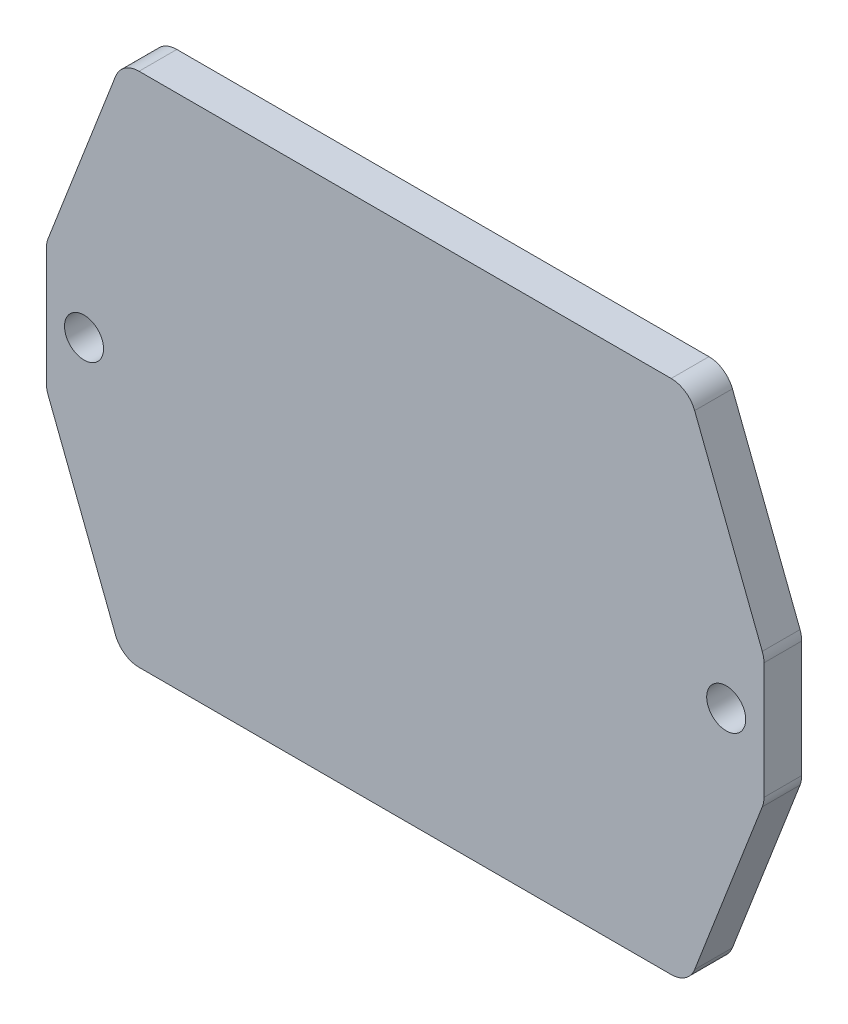
ISO-10303-21;
HEADER;
FILE_DESCRIPTION(('STEP AP214'),'2;1');
FILE_NAME('part.step','',(''),(''),'','','');
FILE_SCHEMA(('AUTOMOTIVE_DESIGN { 1 0 10303 214 1 1 1 1 }'));
ENDSEC;
DATA;
#1=APPLICATION_CONTEXT('core data for automotive mechanical design processes');
#2=APPLICATION_PROTOCOL_DEFINITION('international standard','automotive_design',2000,#1);
#3=PRODUCT_CONTEXT('',#1,'mechanical');
#4=PRODUCT('Part','Part','',(#3));
#5=PRODUCT_RELATED_PRODUCT_CATEGORY('part','',(#4));
#6=PRODUCT_DEFINITION_FORMATION('','',#4);
#7=PRODUCT_DEFINITION_CONTEXT('part definition',#1,'design');
#8=PRODUCT_DEFINITION('design','',#6,#7);
#9=PRODUCT_DEFINITION_SHAPE('','',#8);
#10=(LENGTH_UNIT() NAMED_UNIT(*) SI_UNIT(.MILLI.,.METRE.));
#11=(NAMED_UNIT(*) PLANE_ANGLE_UNIT() SI_UNIT($,.RADIAN.));
#12=(NAMED_UNIT(*) SI_UNIT($,.STERADIAN.) SOLID_ANGLE_UNIT());
#13=UNCERTAINTY_MEASURE_WITH_UNIT(LENGTH_MEASURE(1.E-05),#10,'distance_accuracy_value','');
#14=(GEOMETRIC_REPRESENTATION_CONTEXT(3) GLOBAL_UNCERTAINTY_ASSIGNED_CONTEXT((#13)) GLOBAL_UNIT_ASSIGNED_CONTEXT((#10,
#11,#12)) REPRESENTATION_CONTEXT('',''));
#15=CARTESIAN_POINT('',(0.,0.,0.));
#16=DIRECTION('',(0.,0.,1.));
#17=DIRECTION('',(1.,0.,0.));
#18=AXIS2_PLACEMENT_3D('',#15,#16,#17);
#19=CARTESIAN_POINT('',(-22.5,20.5,3.));
#20=DIRECTION('',(0.,-1.,0.));
#21=DIRECTION('',(0.,0.,-1.));
#22=AXIS2_PLACEMENT_3D('',#19,#20,#21);
#23=PLANE('',#22);
#24=DIRECTION('',(-1.,0.,0.));
#25=VECTOR('',#24,1.);
#26=CARTESIAN_POINT('',(-22.5,20.5,3.));
#27=LINE('',#26,#25);
#28=CARTESIAN_POINT('',(21.1295780466329,20.5,3.));
#29=VERTEX_POINT('',#28);
#30=CARTESIAN_POINT('',(-21.1295780466329,20.5,3.));
#31=VERTEX_POINT('',#30);
#32=EDGE_CURVE('E214',#29,#31,#27,.T.);
#33=ORIENTED_EDGE('',*,*,#32,.F.);
#34=DIRECTION('',(0.,0.,-1.));
#35=VECTOR('',#34,1.);
#36=CARTESIAN_POINT('',(21.1295780466329,20.5,0.));
#37=LINE('',#36,#35);
#38=CARTESIAN_POINT('',(21.1295780466329,20.5,0.));
#39=VERTEX_POINT('',#38);
#40=EDGE_CURVE('E265',#29,#39,#37,.T.);
#41=ORIENTED_EDGE('',*,*,#40,.T.);
#42=DIRECTION('',(-1.,0.,0.));
#43=VECTOR('',#42,1.);
#44=CARTESIAN_POINT('',(-22.5,20.5,0.));
#45=LINE('',#44,#43);
#46=CARTESIAN_POINT('',(-21.1295780466329,20.5,0.));
#47=VERTEX_POINT('',#46);
#48=EDGE_CURVE('E213',#39,#47,#45,.T.);
#49=ORIENTED_EDGE('',*,*,#48,.T.);
#50=DIRECTION('',(0.,0.,-1.));
#51=VECTOR('',#50,1.);
#52=CARTESIAN_POINT('',(-21.1295780466329,20.5,3.));
#53=LINE('',#52,#51);
#54=EDGE_CURVE('E263',#47,#31,#53,.F.);
#55=ORIENTED_EDGE('',*,*,#54,.T.);
#56=EDGE_LOOP('',(#33,#41,#49,#55));
#57=FACE_BOUND('',#56,.T.);
#58=ADVANCED_FACE('F38',(#57),#23,.F.);
#59=CARTESIAN_POINT('',(-22.5,-20.5,3.));
#60=DIRECTION('',(0.,1.,0.));
#61=DIRECTION('',(0.,0.,1.));
#62=AXIS2_PLACEMENT_3D('',#59,#60,#61);
#63=PLANE('',#62);
#64=DIRECTION('',(1.,0.,0.));
#65=VECTOR('',#64,1.);
#66=CARTESIAN_POINT('',(-22.5,-20.5,0.));
#67=LINE('',#66,#65);
#68=CARTESIAN_POINT('',(-21.1295780466329,-20.5,0.));
#69=VERTEX_POINT('',#68);
#70=CARTESIAN_POINT('',(21.1295780466329,-20.5,0.));
#71=VERTEX_POINT('',#70);
#72=EDGE_CURVE('E218',#69,#71,#67,.T.);
#73=ORIENTED_EDGE('',*,*,#72,.T.);
#74=DIRECTION('',(0.,0.,-1.));
#75=VECTOR('',#74,1.);
#76=CARTESIAN_POINT('',(21.1295780466329,-20.5,3.));
#77=LINE('',#76,#75);
#78=CARTESIAN_POINT('',(21.1295780466329,-20.5,3.));
#79=VERTEX_POINT('',#78);
#80=EDGE_CURVE('E157',#71,#79,#77,.F.);
#81=ORIENTED_EDGE('',*,*,#80,.T.);
#82=DIRECTION('',(1.,0.,0.));
#83=VECTOR('',#82,1.);
#84=CARTESIAN_POINT('',(-22.5,-20.5,3.));
#85=LINE('',#84,#83);
#86=CARTESIAN_POINT('',(-21.1295780466329,-20.5,3.));
#87=VERTEX_POINT('',#86);
#88=EDGE_CURVE('E217',#87,#79,#85,.T.);
#89=ORIENTED_EDGE('',*,*,#88,.F.);
#90=DIRECTION('',(0.,0.,-1.));
#91=VECTOR('',#90,1.);
#92=CARTESIAN_POINT('',(-21.1295780466329,-20.5,0.));
#93=LINE('',#92,#91);
#94=EDGE_CURVE('E162',#87,#69,#93,.T.);
#95=ORIENTED_EDGE('',*,*,#94,.T.);
#96=EDGE_LOOP('',(#73,#81,#89,#95));
#97=FACE_BOUND('',#96,.T.);
#98=ADVANCED_FACE('F288',(#97),#63,.F.);
#99=CARTESIAN_POINT('',(0.,0.,3.));
#100=DIRECTION('',(0.,0.,-1.));
#101=DIRECTION('',(-1.,0.,0.));
#102=AXIS2_PLACEMENT_3D('',#99,#100,#101);
#103=PLANE('',#102);
#104=CARTESIAN_POINT('',(25.5,0.,3.));
#105=DIRECTION('',(0.,0.,1.));
#106=DIRECTION('',(1.,0.,0.));
#107=AXIS2_PLACEMENT_3D('',#104,#105,#106);
#108=CIRCLE('',#107,1.55);
#109=CARTESIAN_POINT('',(27.05,0.,3.));
#110=VERTEX_POINT('',#109);
#111=EDGE_CURVE('E378',#110,#110,#108,.T.);
#112=ORIENTED_EDGE('',*,*,#111,.F.);
#113=EDGE_LOOP('',(#112));
#114=FACE_BOUND('',#113,.T.);
#115=CARTESIAN_POINT('',(-25.5,0.,3.));
#116=DIRECTION('',(0.,0.,1.));
#117=DIRECTION('',(-1.,0.,0.));
#118=AXIS2_PLACEMENT_3D('',#115,#116,#117);
#119=CIRCLE('',#118,1.55);
#120=CARTESIAN_POINT('',(-27.05,0.,3.));
#121=VERTEX_POINT('',#120);
#122=EDGE_CURVE('E383',#121,#121,#119,.T.);
#123=ORIENTED_EDGE('',*,*,#122,.F.);
#124=EDGE_LOOP('',(#123));
#125=FACE_BOUND('',#124,.T.);
#126=ORIENTED_EDGE('',*,*,#88,.T.);
#127=CARTESIAN_POINT('',(21.1295780466329,-18.5,3.));
#128=DIRECTION('',(0.,0.,-1.));
#129=DIRECTION('',(-1.,0.,0.));
#130=AXIS2_PLACEMENT_3D('',#127,#128,#129);
#131=CIRCLE('',#130,2.);
#132=CARTESIAN_POINT('',(22.9947142431811,-19.2219882051154,3.));
#133=VERTEX_POINT('',#132);
#134=EDGE_CURVE('E252',#79,#133,#131,.F.);
#135=ORIENTED_EDGE('',*,*,#134,.T.);
#136=DIRECTION('',(0.360994102557712,0.93256809827409,0.));
#137=VECTOR('',#136,1.);
#138=CARTESIAN_POINT('',(22.5,-20.5,3.));
#139=LINE('',#138,#137);
#140=CARTESIAN_POINT('',(28.3651361965482,-5.34839815891721,3.));
#141=VERTEX_POINT('',#140);
#142=EDGE_CURVE('E173',#133,#141,#139,.T.);
#143=ORIENTED_EDGE('',*,*,#142,.T.);
#144=CARTESIAN_POINT('',(26.5,-4.62640995380178,3.));
#145=DIRECTION('',(0.,0.,-1.));
#146=DIRECTION('',(-1.,0.,0.));
#147=AXIS2_PLACEMENT_3D('',#144,#145,#146);
#148=CIRCLE('',#147,2.);
#149=CARTESIAN_POINT('',(28.5,-4.62640995380178,3.));
#150=VERTEX_POINT('',#149);
#151=EDGE_CURVE('E250',#141,#150,#148,.F.);
#152=ORIENTED_EDGE('',*,*,#151,.T.);
#153=DIRECTION('',(0.,1.,0.));
#154=VECTOR('',#153,1.);
#155=CARTESIAN_POINT('',(28.5,-5.,3.));
#156=LINE('',#155,#154);
#157=CARTESIAN_POINT('',(28.5,4.62640995380178,3.));
#158=VERTEX_POINT('',#157);
#159=EDGE_CURVE('E207',#150,#158,#156,.T.);
#160=ORIENTED_EDGE('',*,*,#159,.T.);
#161=CARTESIAN_POINT('',(26.5,4.62640995380178,3.));
#162=DIRECTION('',(0.,0.,-1.));
#163=DIRECTION('',(-1.,0.,0.));
#164=AXIS2_PLACEMENT_3D('',#161,#162,#163);
#165=CIRCLE('',#164,2.);
#166=CARTESIAN_POINT('',(28.3651361965482,5.34839815891721,3.));
#167=VERTEX_POINT('',#166);
#168=EDGE_CURVE('E248',#158,#167,#165,.F.);
#169=ORIENTED_EDGE('',*,*,#168,.T.);
#170=DIRECTION('',(-0.360994102557712,0.93256809827409,0.));
#171=VECTOR('',#170,1.);
#172=CARTESIAN_POINT('',(22.5,20.5,3.));
#173=LINE('',#172,#171);
#174=CARTESIAN_POINT('',(22.9947142431811,19.2219882051154,3.));
#175=VERTEX_POINT('',#174);
#176=EDGE_CURVE('E191',#167,#175,#173,.T.);
#177=ORIENTED_EDGE('',*,*,#176,.T.);
#178=CARTESIAN_POINT('',(21.1295780466329,18.5,3.));
#179=DIRECTION('',(0.,0.,-1.));
#180=DIRECTION('',(-1.,0.,0.));
#181=AXIS2_PLACEMENT_3D('',#178,#179,#180);
#182=CIRCLE('',#181,2.);
#183=EDGE_CURVE('E246',#175,#29,#182,.F.);
#184=ORIENTED_EDGE('',*,*,#183,.T.);
#185=ORIENTED_EDGE('',*,*,#32,.T.);
#186=CARTESIAN_POINT('',(-21.1295780466329,18.5,3.));
#187=DIRECTION('',(0.,0.,-1.));
#188=DIRECTION('',(-1.,0.,0.));
#189=AXIS2_PLACEMENT_3D('',#186,#187,#188);
#190=CIRCLE('',#189,2.);
#191=CARTESIAN_POINT('',(-22.9947142431811,19.2219882051154,3.));
#192=VERTEX_POINT('',#191);
#193=EDGE_CURVE('E244',#31,#192,#190,.F.);
#194=ORIENTED_EDGE('',*,*,#193,.T.);
#195=DIRECTION('',(-0.360994102557712,-0.93256809827409,0.));
#196=VECTOR('',#195,1.);
#197=CARTESIAN_POINT('',(-22.5,20.5,3.));
#198=LINE('',#197,#196);
#199=CARTESIAN_POINT('',(-28.3651361965482,5.34839815891723,3.));
#200=VERTEX_POINT('',#199);
#201=EDGE_CURVE('E197',#192,#200,#198,.T.);
#202=ORIENTED_EDGE('',*,*,#201,.T.);
#203=CARTESIAN_POINT('',(-26.5,4.6264099538018,3.));
#204=DIRECTION('',(0.,0.,-1.));
#205=DIRECTION('',(-1.,0.,0.));
#206=AXIS2_PLACEMENT_3D('',#203,#204,#205);
#207=CIRCLE('',#206,2.);
#208=CARTESIAN_POINT('',(-28.5,4.62640995380181,3.));
#209=VERTEX_POINT('',#208);
#210=EDGE_CURVE('E61',#200,#209,#207,.F.);
#211=ORIENTED_EDGE('',*,*,#210,.T.);
#212=DIRECTION('',(0.,-1.,0.));
#213=VECTOR('',#212,1.);
#214=CARTESIAN_POINT('',(-28.5,-4.99999999999998,3.));
#215=LINE('',#214,#213);
#216=CARTESIAN_POINT('',(-28.5,-4.62640995380177,3.));
#217=VERTEX_POINT('',#216);
#218=EDGE_CURVE('E202',#209,#217,#215,.T.);
#219=ORIENTED_EDGE('',*,*,#218,.T.);
#220=CARTESIAN_POINT('',(-26.5,-4.62640995380177,3.));
#221=DIRECTION('',(0.,0.,-1.));
#222=DIRECTION('',(-1.,0.,0.));
#223=AXIS2_PLACEMENT_3D('',#220,#221,#222);
#224=CIRCLE('',#223,2.);
#225=CARTESIAN_POINT('',(-28.3651361965482,-5.34839815891719,3.));
#226=VERTEX_POINT('',#225);
#227=EDGE_CURVE('E53',#217,#226,#224,.F.);
#228=ORIENTED_EDGE('',*,*,#227,.T.);
#229=DIRECTION('',(0.360994102557712,-0.93256809827409,0.));
#230=VECTOR('',#229,1.);
#231=CARTESIAN_POINT('',(-22.5,-20.5,3.));
#232=LINE('',#231,#230);
#233=CARTESIAN_POINT('',(-22.9947142431811,-19.2219882051154,3.));
#234=VERTEX_POINT('',#233);
#235=EDGE_CURVE('E180',#226,#234,#232,.T.);
#236=ORIENTED_EDGE('',*,*,#235,.T.);
#237=CARTESIAN_POINT('',(-21.1295780466329,-18.5,3.));
#238=DIRECTION('',(0.,0.,-1.));
#239=DIRECTION('',(-1.,0.,0.));
#240=AXIS2_PLACEMENT_3D('',#237,#238,#239);
#241=CIRCLE('',#240,2.);
#242=EDGE_CURVE('E240',#234,#87,#241,.F.);
#243=ORIENTED_EDGE('',*,*,#242,.T.);
#244=EDGE_LOOP('',(#126,#135,#143,#152,#160,#169,#177,#184,#185,#194,#202,#211,#219,#228,#236,#243));
#245=FACE_BOUND('',#244,.T.);
#246=ADVANCED_FACE('F284',(#114,#125,#245),#103,.F.);
#247=CARTESIAN_POINT('',(0.,0.,0.));
#248=DIRECTION('',(0.,0.,-1.));
#249=DIRECTION('',(-1.,0.,0.));
#250=AXIS2_PLACEMENT_3D('',#247,#248,#249);
#251=PLANE('',#250);
#252=CARTESIAN_POINT('',(25.5,0.,0.));
#253=DIRECTION('',(0.,0.,1.));
#254=DIRECTION('',(1.,0.,0.));
#255=AXIS2_PLACEMENT_3D('',#252,#253,#254);
#256=CIRCLE('',#255,1.55);
#257=CARTESIAN_POINT('',(27.05,0.,0.));
#258=VERTEX_POINT('',#257);
#259=EDGE_CURVE('E185',#258,#258,#256,.T.);
#260=ORIENTED_EDGE('',*,*,#259,.T.);
#261=EDGE_LOOP('',(#260));
#262=FACE_BOUND('',#261,.T.);
#263=CARTESIAN_POINT('',(-25.5,0.,0.));
#264=DIRECTION('',(0.,0.,1.));
#265=DIRECTION('',(-1.,0.,0.));
#266=AXIS2_PLACEMENT_3D('',#263,#264,#265);
#267=CIRCLE('',#266,1.55);
#268=CARTESIAN_POINT('',(-27.05,0.,0.));
#269=VERTEX_POINT('',#268);
#270=EDGE_CURVE('E379',#269,#269,#267,.T.);
#271=ORIENTED_EDGE('',*,*,#270,.T.);
#272=EDGE_LOOP('',(#271));
#273=FACE_BOUND('',#272,.T.);
#274=DIRECTION('',(0.360994102557712,0.93256809827409,0.));
#275=VECTOR('',#274,1.);
#276=CARTESIAN_POINT('',(22.5,-20.5,0.));
#277=LINE('',#276,#275);
#278=CARTESIAN_POINT('',(22.9947142431811,-19.2219882051154,0.));
#279=VERTEX_POINT('',#278);
#280=CARTESIAN_POINT('',(28.3651361965482,-5.3483981589172,0.));
#281=VERTEX_POINT('',#280);
#282=EDGE_CURVE('E170',#279,#281,#277,.T.);
#283=ORIENTED_EDGE('',*,*,#282,.F.);
#284=CARTESIAN_POINT('',(21.1295780466329,-18.5,0.));
#285=DIRECTION('',(0.,0.,-1.));
#286=DIRECTION('',(-1.,0.,0.));
#287=AXIS2_PLACEMENT_3D('',#284,#285,#286);
#288=CIRCLE('',#287,2.);
#289=EDGE_CURVE('E152',#279,#71,#288,.T.);
#290=ORIENTED_EDGE('',*,*,#289,.T.);
#291=ORIENTED_EDGE('',*,*,#72,.F.);
#292=CARTESIAN_POINT('',(-21.1295780466329,-18.5,0.));
#293=DIRECTION('',(0.,0.,-1.));
#294=DIRECTION('',(-1.,0.,0.));
#295=AXIS2_PLACEMENT_3D('',#292,#293,#294);
#296=CIRCLE('',#295,2.);
#297=CARTESIAN_POINT('',(-22.9947142431811,-19.2219882051154,0.));
#298=VERTEX_POINT('',#297);
#299=EDGE_CURVE('E174',#69,#298,#296,.T.);
#300=ORIENTED_EDGE('',*,*,#299,.T.);
#301=DIRECTION('',(0.360994102557712,-0.93256809827409,0.));
#302=VECTOR('',#301,1.);
#303=CARTESIAN_POINT('',(-22.5,-20.5,0.));
#304=LINE('',#303,#302);
#305=CARTESIAN_POINT('',(-28.3651361965482,-5.34839815891719,0.));
#306=VERTEX_POINT('',#305);
#307=EDGE_CURVE('E183',#306,#298,#304,.T.);
#308=ORIENTED_EDGE('',*,*,#307,.F.);
#309=CARTESIAN_POINT('',(-26.5,-4.62640995380177,0.));
#310=DIRECTION('',(0.,0.,-1.));
#311=DIRECTION('',(-1.,0.,0.));
#312=AXIS2_PLACEMENT_3D('',#309,#310,#311);
#313=CIRCLE('',#312,2.);
#314=CARTESIAN_POINT('',(-28.5,-4.62640995380177,0.));
#315=VERTEX_POINT('',#314);
#316=EDGE_CURVE('E226',#306,#315,#313,.T.);
#317=ORIENTED_EDGE('',*,*,#316,.T.);
#318=DIRECTION('',(0.,-1.,0.));
#319=VECTOR('',#318,1.);
#320=CARTESIAN_POINT('',(-28.5,-4.99999999999998,0.));
#321=LINE('',#320,#319);
#322=CARTESIAN_POINT('',(-28.5,4.62640995380181,0.));
#323=VERTEX_POINT('',#322);
#324=EDGE_CURVE('E204',#323,#315,#321,.T.);
#325=ORIENTED_EDGE('',*,*,#324,.F.);
#326=CARTESIAN_POINT('',(-26.5,4.6264099538018,0.));
#327=DIRECTION('',(0.,0.,-1.));
#328=DIRECTION('',(-1.,0.,0.));
#329=AXIS2_PLACEMENT_3D('',#326,#327,#328);
#330=CIRCLE('',#329,2.);
#331=CARTESIAN_POINT('',(-28.3651361965482,5.34839815891723,0.));
#332=VERTEX_POINT('',#331);
#333=EDGE_CURVE('E228',#323,#332,#330,.T.);
#334=ORIENTED_EDGE('',*,*,#333,.T.);
#335=DIRECTION('',(-0.360994102557712,-0.93256809827409,0.));
#336=VECTOR('',#335,1.);
#337=CARTESIAN_POINT('',(-22.5,20.5,0.));
#338=LINE('',#337,#336);
#339=CARTESIAN_POINT('',(-22.9947142431811,19.2219882051154,0.));
#340=VERTEX_POINT('',#339);
#341=EDGE_CURVE('E199',#340,#332,#338,.T.);
#342=ORIENTED_EDGE('',*,*,#341,.F.);
#343=CARTESIAN_POINT('',(-21.1295780466329,18.5,0.));
#344=DIRECTION('',(0.,0.,-1.));
#345=DIRECTION('',(-1.,0.,0.));
#346=AXIS2_PLACEMENT_3D('',#343,#344,#345);
#347=CIRCLE('',#346,2.);
#348=EDGE_CURVE('E230',#340,#47,#347,.T.);
#349=ORIENTED_EDGE('',*,*,#348,.T.);
#350=ORIENTED_EDGE('',*,*,#48,.F.);
#351=CARTESIAN_POINT('',(21.1295780466329,18.5,0.));
#352=DIRECTION('',(0.,0.,-1.));
#353=DIRECTION('',(-1.,0.,0.));
#354=AXIS2_PLACEMENT_3D('',#351,#352,#353);
#355=CIRCLE('',#354,2.);
#356=CARTESIAN_POINT('',(22.9947142431811,19.2219882051154,0.));
#357=VERTEX_POINT('',#356);
#358=EDGE_CURVE('E232',#39,#357,#355,.T.);
#359=ORIENTED_EDGE('',*,*,#358,.T.);
#360=DIRECTION('',(-0.360994102557712,0.93256809827409,0.));
#361=VECTOR('',#360,1.);
#362=CARTESIAN_POINT('',(22.5,20.5,0.));
#363=LINE('',#362,#361);
#364=CARTESIAN_POINT('',(28.3651361965482,5.34839815891721,0.));
#365=VERTEX_POINT('',#364);
#366=EDGE_CURVE('E194',#365,#357,#363,.T.);
#367=ORIENTED_EDGE('',*,*,#366,.F.);
#368=CARTESIAN_POINT('',(26.5,4.62640995380178,0.));
#369=DIRECTION('',(0.,0.,-1.));
#370=DIRECTION('',(-1.,0.,0.));
#371=AXIS2_PLACEMENT_3D('',#368,#369,#370);
#372=CIRCLE('',#371,2.);
#373=CARTESIAN_POINT('',(28.5,4.62640995380178,0.));
#374=VERTEX_POINT('',#373);
#375=EDGE_CURVE('E234',#365,#374,#372,.T.);
#376=ORIENTED_EDGE('',*,*,#375,.T.);
#377=DIRECTION('',(0.,1.,0.));
#378=VECTOR('',#377,1.);
#379=CARTESIAN_POINT('',(28.5,-5.,0.));
#380=LINE('',#379,#378);
#381=CARTESIAN_POINT('',(28.5,-4.62640995380178,0.));
#382=VERTEX_POINT('',#381);
#383=EDGE_CURVE('E210',#382,#374,#380,.T.);
#384=ORIENTED_EDGE('',*,*,#383,.F.);
#385=CARTESIAN_POINT('',(26.5,-4.62640995380178,0.));
#386=DIRECTION('',(0.,0.,-1.));
#387=DIRECTION('',(-1.,0.,0.));
#388=AXIS2_PLACEMENT_3D('',#385,#386,#387);
#389=CIRCLE('',#388,2.);
#390=EDGE_CURVE('E163',#382,#281,#389,.T.);
#391=ORIENTED_EDGE('',*,*,#390,.T.);
#392=EDGE_LOOP('',(#283,#290,#291,#300,#308,#317,#325,#334,#342,#349,#350,#359,#367,#376,#384,#391));
#393=FACE_BOUND('',#392,.T.);
#394=ADVANCED_FACE('F177',(#262,#273,#393),#251,.T.);
#395=CARTESIAN_POINT('',(28.5,-5.,-15.6204993518133));
#396=DIRECTION('',(1.,0.,0.));
#397=DIRECTION('',(0.,0.,-1.));
#398=AXIS2_PLACEMENT_3D('',#395,#396,#397);
#399=PLANE('',#398);
#400=ORIENTED_EDGE('',*,*,#159,.F.);
#401=DIRECTION('',(0.,0.,1.));
#402=VECTOR('',#401,1.);
#403=CARTESIAN_POINT('',(28.5,-4.62640995380178,-15.6204993518133));
#404=LINE('',#403,#402);
#405=EDGE_CURVE('E257',#150,#382,#404,.F.);
#406=ORIENTED_EDGE('',*,*,#405,.T.);
#407=ORIENTED_EDGE('',*,*,#383,.T.);
#408=DIRECTION('',(0.,0.,1.));
#409=VECTOR('',#408,1.);
#410=CARTESIAN_POINT('',(28.5,4.62640995380178,-15.6204993518133));
#411=LINE('',#410,#409);
#412=EDGE_CURVE('E254',#374,#158,#411,.T.);
#413=ORIENTED_EDGE('',*,*,#412,.T.);
#414=EDGE_LOOP('',(#400,#406,#407,#413));
#415=FACE_BOUND('',#414,.T.);
#416=ADVANCED_FACE('F327',(#415),#399,.T.);
#417=CARTESIAN_POINT('',(-28.5,-4.99999999999998,-15.6204993518133));
#418=DIRECTION('',(-1.,0.,0.));
#419=DIRECTION('',(0.,-1.,0.));
#420=AXIS2_PLACEMENT_3D('',#417,#418,#419);
#421=PLANE('',#420);
#422=ORIENTED_EDGE('',*,*,#218,.F.);
#423=DIRECTION('',(0.,0.,1.));
#424=VECTOR('',#423,1.);
#425=CARTESIAN_POINT('',(-28.5,4.62640995380181,-15.6204993518133));
#426=LINE('',#425,#424);
#427=EDGE_CURVE('E276',#209,#323,#426,.F.);
#428=ORIENTED_EDGE('',*,*,#427,.T.);
#429=ORIENTED_EDGE('',*,*,#324,.T.);
#430=DIRECTION('',(0.,0.,1.));
#431=VECTOR('',#430,1.);
#432=CARTESIAN_POINT('',(-28.5,-4.62640995380177,-15.6204993518133));
#433=LINE('',#432,#431);
#434=EDGE_CURVE('E274',#315,#217,#433,.T.);
#435=ORIENTED_EDGE('',*,*,#434,.T.);
#436=EDGE_LOOP('',(#422,#428,#429,#435));
#437=FACE_BOUND('',#436,.T.);
#438=ADVANCED_FACE('F293',(#437),#421,.T.);
#439=CARTESIAN_POINT('',(-22.5,20.5,-16.6207701385947));
#440=DIRECTION('',(-0.932568098274089,0.360994102557712,0.));
#441=DIRECTION('',(-0.360994102557712,-0.93256809827409,0.));
#442=AXIS2_PLACEMENT_3D('',#439,#440,#441);
#443=PLANE('',#442);
#444=ORIENTED_EDGE('',*,*,#201,.F.);
#445=DIRECTION('',(0.,0.,-1.));
#446=VECTOR('',#445,1.);
#447=CARTESIAN_POINT('',(-22.9947142431811,19.2219882051154,0.));
#448=LINE('',#447,#446);
#449=EDGE_CURVE('E271',#192,#340,#448,.T.);
#450=ORIENTED_EDGE('',*,*,#449,.T.);
#451=ORIENTED_EDGE('',*,*,#341,.T.);
#452=DIRECTION('',(0.,0.,1.));
#453=VECTOR('',#452,1.);
#454=CARTESIAN_POINT('',(-28.3651361965482,5.34839815891723,-16.6207701385947));
#455=LINE('',#454,#453);
#456=EDGE_CURVE('E268',#332,#200,#455,.T.);
#457=ORIENTED_EDGE('',*,*,#456,.T.);
#458=EDGE_LOOP('',(#444,#450,#451,#457));
#459=FACE_BOUND('',#458,.T.);
#460=ADVANCED_FACE('F302',(#459),#443,.T.);
#461=CARTESIAN_POINT('',(22.5,20.5,-16.6207701385947));
#462=DIRECTION('',(0.932568098274089,0.360994102557712,0.));
#463=DIRECTION('',(-0.360994102557712,0.93256809827409,0.));
#464=AXIS2_PLACEMENT_3D('',#461,#462,#463);
#465=PLANE('',#464);
#466=ORIENTED_EDGE('',*,*,#176,.F.);
#467=DIRECTION('',(0.,0.,1.));
#468=VECTOR('',#467,1.);
#469=CARTESIAN_POINT('',(28.3651361965482,5.34839815891721,-16.6207701385947));
#470=LINE('',#469,#468);
#471=EDGE_CURVE('E261',#167,#365,#470,.F.);
#472=ORIENTED_EDGE('',*,*,#471,.T.);
#473=ORIENTED_EDGE('',*,*,#366,.T.);
#474=DIRECTION('',(0.,0.,-1.));
#475=VECTOR('',#474,1.);
#476=CARTESIAN_POINT('',(22.9947142431811,19.2219882051154,3.));
#477=LINE('',#476,#475);
#478=EDGE_CURVE('E259',#357,#175,#477,.F.);
#479=ORIENTED_EDGE('',*,*,#478,.T.);
#480=EDGE_LOOP('',(#466,#472,#473,#479));
#481=FACE_BOUND('',#480,.T.);
#482=ADVANCED_FACE('F320',(#481),#465,.T.);
#483=CARTESIAN_POINT('',(-22.5,-20.5,-16.6207701385947));
#484=DIRECTION('',(-0.932568098274089,-0.360994102557712,0.));
#485=DIRECTION('',(0.360994102557712,-0.93256809827409,0.));
#486=AXIS2_PLACEMENT_3D('',#483,#484,#485);
#487=PLANE('',#486);
#488=ORIENTED_EDGE('',*,*,#235,.F.);
#489=DIRECTION('',(0.,0.,1.));
#490=VECTOR('',#489,1.);
#491=CARTESIAN_POINT('',(-28.3651361965482,-5.3483981589172,-16.6207701385947));
#492=LINE('',#491,#490);
#493=EDGE_CURVE('E11',#226,#306,#492,.F.);
#494=ORIENTED_EDGE('',*,*,#493,.T.);
#495=ORIENTED_EDGE('',*,*,#307,.T.);
#496=DIRECTION('',(0.,0.,-1.));
#497=VECTOR('',#496,1.);
#498=CARTESIAN_POINT('',(-22.9947142431811,-19.2219882051154,3.));
#499=LINE('',#498,#497);
#500=EDGE_CURVE('E46',#298,#234,#499,.F.);
#501=ORIENTED_EDGE('',*,*,#500,.T.);
#502=EDGE_LOOP('',(#488,#494,#495,#501));
#503=FACE_BOUND('',#502,.T.);
#504=ADVANCED_FACE('F280',(#503),#487,.T.);
#505=CARTESIAN_POINT('',(22.5,-20.5,-16.6207701385947));
#506=DIRECTION('',(0.932568098274089,-0.360994102557712,0.));
#507=DIRECTION('',(0.360994102557712,0.93256809827409,0.));
#508=AXIS2_PLACEMENT_3D('',#505,#506,#507);
#509=PLANE('',#508);
#510=ORIENTED_EDGE('',*,*,#142,.F.);
#511=DIRECTION('',(0.,0.,-1.));
#512=VECTOR('',#511,1.);
#513=CARTESIAN_POINT('',(22.9947142431811,-19.2219882051154,0.));
#514=LINE('',#513,#512);
#515=EDGE_CURVE('E156',#133,#279,#514,.T.);
#516=ORIENTED_EDGE('',*,*,#515,.T.);
#517=ORIENTED_EDGE('',*,*,#282,.T.);
#518=DIRECTION('',(0.,0.,1.));
#519=VECTOR('',#518,1.);
#520=CARTESIAN_POINT('',(28.3651361965482,-5.3483981589172,-16.6207701385947));
#521=LINE('',#520,#519);
#522=EDGE_CURVE('E175',#281,#141,#521,.T.);
#523=ORIENTED_EDGE('',*,*,#522,.T.);
#524=EDGE_LOOP('',(#510,#516,#517,#523));
#525=FACE_BOUND('',#524,.T.);
#526=ADVANCED_FACE('F168',(#525),#509,.T.);
#527=CARTESIAN_POINT('',(-25.5,0.,0.));
#528=DIRECTION('',(0.,0.,1.));
#529=DIRECTION('',(1.,0.,0.));
#530=AXIS2_PLACEMENT_3D('',#527,#528,#529);
#531=CYLINDRICAL_SURFACE('',#530,1.55);
#532=ORIENTED_EDGE('',*,*,#270,.F.);
#533=EDGE_LOOP('',(#532));
#534=FACE_BOUND('',#533,.T.);
#535=ORIENTED_EDGE('',*,*,#122,.T.);
#536=EDGE_LOOP('',(#535));
#537=FACE_BOUND('',#536,.T.);
#538=ADVANCED_FACE('F365',(#534,#537),#531,.F.);
#539=CARTESIAN_POINT('',(25.5,0.,0.));
#540=DIRECTION('',(0.,0.,1.));
#541=DIRECTION('',(1.,0.,0.));
#542=AXIS2_PLACEMENT_3D('',#539,#540,#541);
#543=CYLINDRICAL_SURFACE('',#542,1.55);
#544=ORIENTED_EDGE('',*,*,#259,.F.);
#545=EDGE_LOOP('',(#544));
#546=FACE_BOUND('',#545,.T.);
#547=ORIENTED_EDGE('',*,*,#111,.T.);
#548=EDGE_LOOP('',(#547));
#549=FACE_BOUND('',#548,.T.);
#550=ADVANCED_FACE('F338',(#546,#549),#543,.F.);
#551=CARTESIAN_POINT('',(21.1295780466329,-18.5,-16.6207701385947));
#552=DIRECTION('',(0.,0.,1.));
#553=DIRECTION('',(1.,0.,0.));
#554=AXIS2_PLACEMENT_3D('',#551,#552,#553);
#555=CYLINDRICAL_SURFACE('',#554,2.);
#556=ORIENTED_EDGE('',*,*,#134,.F.);
#557=ORIENTED_EDGE('',*,*,#80,.F.);
#558=ORIENTED_EDGE('',*,*,#289,.F.);
#559=ORIENTED_EDGE('',*,*,#515,.F.);
#560=EDGE_LOOP('',(#556,#557,#558,#559));
#561=FACE_BOUND('',#560,.T.);
#562=ADVANCED_FACE('F155',(#561),#555,.T.);
#563=CARTESIAN_POINT('',(26.5,-4.62640995380178,-16.6207701385947));
#564=DIRECTION('',(0.,0.,1.));
#565=DIRECTION('',(1.,0.,0.));
#566=AXIS2_PLACEMENT_3D('',#563,#564,#565);
#567=CYLINDRICAL_SURFACE('',#566,2.);
#568=ORIENTED_EDGE('',*,*,#390,.F.);
#569=ORIENTED_EDGE('',*,*,#405,.F.);
#570=ORIENTED_EDGE('',*,*,#151,.F.);
#571=ORIENTED_EDGE('',*,*,#522,.F.);
#572=EDGE_LOOP('',(#568,#569,#570,#571));
#573=FACE_BOUND('',#572,.T.);
#574=ADVANCED_FACE('F330',(#573),#567,.T.);
#575=CARTESIAN_POINT('',(26.5,4.62640995380178,-15.6204993518133));
#576=DIRECTION('',(0.,0.,1.));
#577=DIRECTION('',(1.,0.,0.));
#578=AXIS2_PLACEMENT_3D('',#575,#576,#577);
#579=CYLINDRICAL_SURFACE('',#578,2.);
#580=ORIENTED_EDGE('',*,*,#375,.F.);
#581=ORIENTED_EDGE('',*,*,#471,.F.);
#582=ORIENTED_EDGE('',*,*,#168,.F.);
#583=ORIENTED_EDGE('',*,*,#412,.F.);
#584=EDGE_LOOP('',(#580,#581,#582,#583));
#585=FACE_BOUND('',#584,.T.);
#586=ADVANCED_FACE('F323',(#585),#579,.T.);
#587=CARTESIAN_POINT('',(21.1295780466329,18.5,3.));
#588=DIRECTION('',(0.,0.,1.));
#589=DIRECTION('',(1.,0.,0.));
#590=AXIS2_PLACEMENT_3D('',#587,#588,#589);
#591=CYLINDRICAL_SURFACE('',#590,2.);
#592=ORIENTED_EDGE('',*,*,#183,.F.);
#593=ORIENTED_EDGE('',*,*,#478,.F.);
#594=ORIENTED_EDGE('',*,*,#358,.F.);
#595=ORIENTED_EDGE('',*,*,#40,.F.);
#596=EDGE_LOOP('',(#592,#593,#594,#595));
#597=FACE_BOUND('',#596,.T.);
#598=ADVANCED_FACE('F314',(#597),#591,.T.);
#599=CARTESIAN_POINT('',(-21.1295780466329,18.5,-16.6207701385947));
#600=DIRECTION('',(0.,0.,1.));
#601=DIRECTION('',(1.,0.,0.));
#602=AXIS2_PLACEMENT_3D('',#599,#600,#601);
#603=CYLINDRICAL_SURFACE('',#602,2.);
#604=ORIENTED_EDGE('',*,*,#193,.F.);
#605=ORIENTED_EDGE('',*,*,#54,.F.);
#606=ORIENTED_EDGE('',*,*,#348,.F.);
#607=ORIENTED_EDGE('',*,*,#449,.F.);
#608=EDGE_LOOP('',(#604,#605,#606,#607));
#609=FACE_BOUND('',#608,.T.);
#610=ADVANCED_FACE('F308',(#609),#603,.T.);
#611=CARTESIAN_POINT('',(-26.5,4.6264099538018,-16.6207701385947));
#612=DIRECTION('',(0.,0.,1.));
#613=DIRECTION('',(1.,0.,0.));
#614=AXIS2_PLACEMENT_3D('',#611,#612,#613);
#615=CYLINDRICAL_SURFACE('',#614,2.);
#616=ORIENTED_EDGE('',*,*,#333,.F.);
#617=ORIENTED_EDGE('',*,*,#427,.F.);
#618=ORIENTED_EDGE('',*,*,#210,.F.);
#619=ORIENTED_EDGE('',*,*,#456,.F.);
#620=EDGE_LOOP('',(#616,#617,#618,#619));
#621=FACE_BOUND('',#620,.T.);
#622=ADVANCED_FACE('F299',(#621),#615,.T.);
#623=CARTESIAN_POINT('',(-26.5,-4.62640995380177,-15.6204993518133));
#624=DIRECTION('',(0.,0.,1.));
#625=DIRECTION('',(1.,0.,0.));
#626=AXIS2_PLACEMENT_3D('',#623,#624,#625);
#627=CYLINDRICAL_SURFACE('',#626,2.);
#628=ORIENTED_EDGE('',*,*,#316,.F.);
#629=ORIENTED_EDGE('',*,*,#493,.F.);
#630=ORIENTED_EDGE('',*,*,#227,.F.);
#631=ORIENTED_EDGE('',*,*,#434,.F.);
#632=EDGE_LOOP('',(#628,#629,#630,#631));
#633=FACE_BOUND('',#632,.T.);
#634=ADVANCED_FACE('F291',(#633),#627,.T.);
#635=CARTESIAN_POINT('',(-21.1295780466329,-18.5,3.));
#636=DIRECTION('',(0.,0.,1.));
#637=DIRECTION('',(1.,0.,0.));
#638=AXIS2_PLACEMENT_3D('',#635,#636,#637);
#639=CYLINDRICAL_SURFACE('',#638,2.);
#640=ORIENTED_EDGE('',*,*,#242,.F.);
#641=ORIENTED_EDGE('',*,*,#500,.F.);
#642=ORIENTED_EDGE('',*,*,#299,.F.);
#643=ORIENTED_EDGE('',*,*,#94,.F.);
#644=EDGE_LOOP('',(#640,#641,#642,#643));
#645=FACE_BOUND('',#644,.T.);
#646=ADVANCED_FACE('F40',(#645),#639,.T.);
#647=CLOSED_SHELL('',(#58,#98,#246,#394,#416,#438,#460,#482,#504,#526,#538,#550,#562,#574,#586,
#598,#610,#622,#634,#646));
#648=MANIFOLD_SOLID_BREP('B2',#647);
#649=ADVANCED_BREP_SHAPE_REPRESENTATION('',(#18,#648),#14);
#650=SHAPE_DEFINITION_REPRESENTATION(#9,#649);
ENDSEC;
END-ISO-10303-21;
